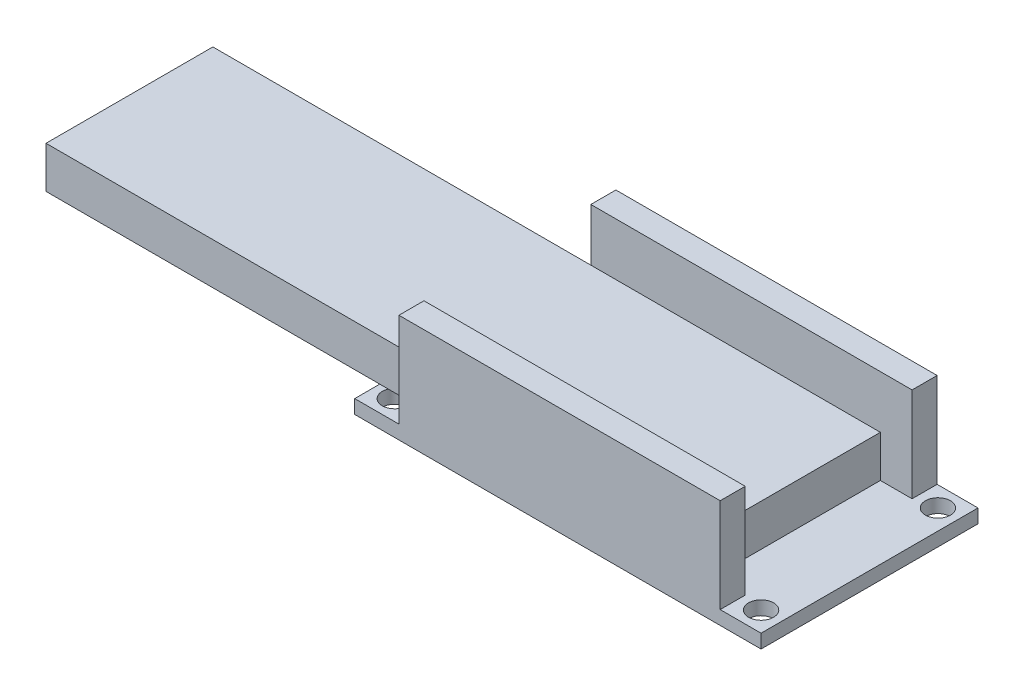
ISO-10303-21;
HEADER;
FILE_DESCRIPTION(('STEP AP214'),'2;1');
FILE_NAME('part.step','',(''),(''),'','','');
FILE_SCHEMA(('AUTOMOTIVE_DESIGN { 1 0 10303 214 1 1 1 1 }'));
ENDSEC;
DATA;
#1=APPLICATION_CONTEXT('core data for automotive mechanical design processes');
#2=APPLICATION_PROTOCOL_DEFINITION('international standard','automotive_design',2000,#1);
#3=PRODUCT_CONTEXT('',#1,'mechanical');
#4=PRODUCT('Part','Part','',(#3));
#5=PRODUCT_RELATED_PRODUCT_CATEGORY('part','',(#4));
#6=PRODUCT_DEFINITION_FORMATION('','',#4);
#7=PRODUCT_DEFINITION_CONTEXT('part definition',#1,'design');
#8=PRODUCT_DEFINITION('design','',#6,#7);
#9=PRODUCT_DEFINITION_SHAPE('','',#8);
#10=(LENGTH_UNIT() NAMED_UNIT(*) SI_UNIT(.MILLI.,.METRE.));
#11=(NAMED_UNIT(*) PLANE_ANGLE_UNIT() SI_UNIT($,.RADIAN.));
#12=(NAMED_UNIT(*) SI_UNIT($,.STERADIAN.) SOLID_ANGLE_UNIT());
#13=UNCERTAINTY_MEASURE_WITH_UNIT(LENGTH_MEASURE(1.E-05),#10,'distance_accuracy_value','');
#14=(GEOMETRIC_REPRESENTATION_CONTEXT(3) GLOBAL_UNCERTAINTY_ASSIGNED_CONTEXT((#13)) GLOBAL_UNIT_ASSIGNED_CONTEXT((#10,
#11,#12)) REPRESENTATION_CONTEXT('',''));
#15=CARTESIAN_POINT('',(0.,0.,0.));
#16=DIRECTION('',(0.,0.,1.));
#17=DIRECTION('',(1.,0.,0.));
#18=AXIS2_PLACEMENT_3D('',#15,#16,#17);
#19=CARTESIAN_POINT('',(0.,1.65,0.));
#20=DIRECTION('',(0.,1.,0.));
#21=DIRECTION('',(0.,0.,1.));
#22=AXIS2_PLACEMENT_3D('',#19,#20,#21);
#23=PLANE('',#22);
#24=CARTESIAN_POINT('',(21.95,1.65,10.6));
#25=DIRECTION('',(0.,1.,0.));
#26=DIRECTION('',(0.,0.,1.));
#27=AXIS2_PLACEMENT_3D('',#24,#25,#26);
#28=CIRCLE('',#27,1.5);
#29=CARTESIAN_POINT('',(21.95,1.65,12.1));
#30=VERTEX_POINT('',#29);
#31=EDGE_CURVE('E296',#30,#30,#28,.T.);
#32=ORIENTED_EDGE('',*,*,#31,.F.);
#33=EDGE_LOOP('',(#32));
#34=FACE_BOUND('',#33,.T.);
#35=CARTESIAN_POINT('',(21.95,1.65,-10.6));
#36=DIRECTION('',(0.,1.,0.));
#37=DIRECTION('',(0.,0.,-1.));
#38=AXIS2_PLACEMENT_3D('',#35,#36,#37);
#39=CIRCLE('',#38,1.5);
#40=CARTESIAN_POINT('',(21.95,1.65,-12.1));
#41=VERTEX_POINT('',#40);
#42=EDGE_CURVE('E290',#41,#41,#39,.T.);
#43=ORIENTED_EDGE('',*,*,#42,.F.);
#44=EDGE_LOOP('',(#43));
#45=FACE_BOUND('',#44,.T.);
#46=DIRECTION('',(1.,0.,0.));
#47=VECTOR('',#46,1.);
#48=CARTESIAN_POINT('',(-19.05,1.65,-10.));
#49=LINE('',#48,#47);
#50=CARTESIAN_POINT('',(15.65,1.65,-10.));
#51=VERTEX_POINT('',#50);
#52=CARTESIAN_POINT('',(19.45,1.65,-10.));
#53=VERTEX_POINT('',#52);
#54=EDGE_CURVE('E275',#51,#53,#49,.T.);
#55=ORIENTED_EDGE('',*,*,#54,.F.);
#56=DIRECTION('',(0.,0.,-1.));
#57=VECTOR('',#56,1.);
#58=CARTESIAN_POINT('',(15.65,1.65,-10.));
#59=LINE('',#58,#57);
#60=CARTESIAN_POINT('',(15.65,1.65,10.));
#61=VERTEX_POINT('',#60);
#62=EDGE_CURVE('E193',#61,#51,#59,.T.);
#63=ORIENTED_EDGE('',*,*,#62,.F.);
#64=DIRECTION('',(-1.,0.,0.));
#65=VECTOR('',#64,1.);
#66=CARTESIAN_POINT('',(-19.05,1.65,10.));
#67=LINE('',#66,#65);
#68=CARTESIAN_POINT('',(19.45,1.65,10.));
#69=VERTEX_POINT('',#68);
#70=EDGE_CURVE('E51',#69,#61,#67,.T.);
#71=ORIENTED_EDGE('',*,*,#70,.F.);
#72=DIRECTION('',(0.,0.,-1.));
#73=VECTOR('',#72,1.);
#74=CARTESIAN_POINT('',(19.45,1.65,13.));
#75=LINE('',#74,#73);
#76=CARTESIAN_POINT('',(19.45,1.65,13.));
#77=VERTEX_POINT('',#76);
#78=EDGE_CURVE('E252',#77,#69,#75,.T.);
#79=ORIENTED_EDGE('',*,*,#78,.F.);
#80=DIRECTION('',(1.,0.,0.));
#81=VECTOR('',#80,1.);
#82=CARTESIAN_POINT('',(-24.35,1.65,13.));
#83=LINE('',#82,#81);
#84=CARTESIAN_POINT('',(24.35,1.65,13.));
#85=VERTEX_POINT('',#84);
#86=EDGE_CURVE('E325',#77,#85,#83,.T.);
#87=ORIENTED_EDGE('',*,*,#86,.T.);
#88=DIRECTION('',(0.,0.,-1.));
#89=VECTOR('',#88,1.);
#90=CARTESIAN_POINT('',(24.35,1.65,-13.));
#91=LINE('',#90,#89);
#92=CARTESIAN_POINT('',(24.35,1.65,-13.));
#93=VERTEX_POINT('',#92);
#94=EDGE_CURVE('E314',#85,#93,#91,.T.);
#95=ORIENTED_EDGE('',*,*,#94,.T.);
#96=DIRECTION('',(-1.,0.,0.));
#97=VECTOR('',#96,1.);
#98=CARTESIAN_POINT('',(-24.35,1.65,-13.));
#99=LINE('',#98,#97);
#100=CARTESIAN_POINT('',(19.45,1.65,-13.));
#101=VERTEX_POINT('',#100);
#102=EDGE_CURVE('E319',#93,#101,#99,.T.);
#103=ORIENTED_EDGE('',*,*,#102,.T.);
#104=DIRECTION('',(0.,0.,-1.));
#105=VECTOR('',#104,1.);
#106=CARTESIAN_POINT('',(19.45,1.65,-13.));
#107=LINE('',#106,#105);
#108=EDGE_CURVE('E266',#53,#101,#107,.T.);
#109=ORIENTED_EDGE('',*,*,#108,.F.);
#110=EDGE_LOOP('',(#55,#63,#71,#79,#87,#95,#103,#109));
#111=FACE_BOUND('',#110,.T.);
#112=ADVANCED_FACE('F36',(#34,#45,#111),#23,.T.);
#113=DIRECTION('',(0.,0.,1.));
#114=VECTOR('',#113,1.);
#115=CARTESIAN_POINT('',(-24.35,1.65,-13.));
#116=LINE('',#115,#114);
#117=CARTESIAN_POINT('',(-24.35,1.65,-13.));
#118=VERTEX_POINT('',#117);
#119=CARTESIAN_POINT('',(-24.35,1.65,-10.));
#120=VERTEX_POINT('',#119);
#121=EDGE_CURVE('E322',#118,#120,#116,.T.);
#122=ORIENTED_EDGE('',*,*,#121,.T.);
#123=DIRECTION('',(-1.,0.,0.));
#124=VECTOR('',#123,1.);
#125=CARTESIAN_POINT('',(-64.35,1.65,-10.));
#126=LINE('',#125,#124);
#127=CARTESIAN_POINT('',(-23.3247727084868,1.65,-10.));
#128=VERTEX_POINT('',#127);
#129=EDGE_CURVE('E213',#128,#120,#126,.T.);
#130=ORIENTED_EDGE('',*,*,#129,.F.);
#131=CARTESIAN_POINT('',(-21.95,1.65,-10.6));
#132=DIRECTION('',(0.,1.,0.));
#133=DIRECTION('',(0.,0.,1.));
#134=AXIS2_PLACEMENT_3D('',#131,#132,#133);
#135=CIRCLE('',#134,1.5);
#136=CARTESIAN_POINT('',(-20.5752272915132,1.65,-10.));
#137=VERTEX_POINT('',#136);
#138=EDGE_CURVE('E308',#137,#128,#135,.T.);
#139=ORIENTED_EDGE('',*,*,#138,.F.);
#140=CARTESIAN_POINT('',(-19.05,1.65,-10.));
#141=VERTEX_POINT('',#140);
#142=EDGE_CURVE('E214',#141,#137,#126,.T.);
#143=ORIENTED_EDGE('',*,*,#142,.F.);
#144=DIRECTION('',(0.,0.,1.));
#145=VECTOR('',#144,1.);
#146=CARTESIAN_POINT('',(-19.05,1.65,-13.));
#147=LINE('',#146,#145);
#148=CARTESIAN_POINT('',(-19.05,1.65,-13.));
#149=VERTEX_POINT('',#148);
#150=EDGE_CURVE('E254',#149,#141,#147,.T.);
#151=ORIENTED_EDGE('',*,*,#150,.F.);
#152=EDGE_CURVE('E317',#149,#118,#99,.T.);
#153=ORIENTED_EDGE('',*,*,#152,.T.);
#154=EDGE_LOOP('',(#122,#130,#139,#143,#151,#153));
#155=FACE_BOUND('',#154,.T.);
#156=ADVANCED_FACE('F387',(#155),#23,.T.);
#157=DIRECTION('',(0.,0.,1.));
#158=VECTOR('',#157,1.);
#159=CARTESIAN_POINT('',(-19.05,1.65,13.));
#160=LINE('',#159,#158);
#161=CARTESIAN_POINT('',(-19.05,1.65,10.));
#162=VERTEX_POINT('',#161);
#163=CARTESIAN_POINT('',(-19.05,1.65,13.));
#164=VERTEX_POINT('',#163);
#165=EDGE_CURVE('E247',#162,#164,#160,.T.);
#166=ORIENTED_EDGE('',*,*,#165,.F.);
#167=DIRECTION('',(1.,0.,0.));
#168=VECTOR('',#167,1.);
#169=CARTESIAN_POINT('',(-64.35,1.65,10.));
#170=LINE('',#169,#168);
#171=CARTESIAN_POINT('',(-20.5752272915132,1.65,10.));
#172=VERTEX_POINT('',#171);
#173=EDGE_CURVE('E59',#172,#162,#170,.T.);
#174=ORIENTED_EDGE('',*,*,#173,.F.);
#175=CARTESIAN_POINT('',(-21.95,1.65,10.6));
#176=DIRECTION('',(0.,1.,0.));
#177=DIRECTION('',(0.,0.,-1.));
#178=AXIS2_PLACEMENT_3D('',#175,#176,#177);
#179=CIRCLE('',#178,1.5);
#180=CARTESIAN_POINT('',(-23.3247727084868,1.65,10.));
#181=VERTEX_POINT('',#180);
#182=EDGE_CURVE('E302',#181,#172,#179,.T.);
#183=ORIENTED_EDGE('',*,*,#182,.F.);
#184=CARTESIAN_POINT('',(-24.35,1.65,10.));
#185=VERTEX_POINT('',#184);
#186=EDGE_CURVE('E219',#185,#181,#170,.T.);
#187=ORIENTED_EDGE('',*,*,#186,.F.);
#188=CARTESIAN_POINT('',(-24.35,1.65,13.));
#189=VERTEX_POINT('',#188);
#190=EDGE_CURVE('E321',#185,#189,#116,.T.);
#191=ORIENTED_EDGE('',*,*,#190,.T.);
#192=EDGE_CURVE('E326',#189,#164,#83,.T.);
#193=ORIENTED_EDGE('',*,*,#192,.T.);
#194=EDGE_LOOP('',(#166,#174,#183,#187,#191,#193));
#195=FACE_BOUND('',#194,.T.);
#196=ADVANCED_FACE('F378',(#195),#23,.T.);
#197=CARTESIAN_POINT('',(-19.05,12.95,-10.));
#198=DIRECTION('',(0.,0.,-1.));
#199=DIRECTION('',(-1.,0.,0.));
#200=AXIS2_PLACEMENT_3D('',#197,#198,#199);
#201=PLANE('',#200);
#202=DIRECTION('',(0.,-1.,0.));
#203=VECTOR('',#202,1.);
#204=CARTESIAN_POINT('',(15.65,6.65,-10.));
#205=LINE('',#204,#203);
#206=CARTESIAN_POINT('',(15.65,6.65,-10.));
#207=VERTEX_POINT('',#206);
#208=EDGE_CURVE('E191',#207,#51,#205,.T.);
#209=ORIENTED_EDGE('',*,*,#208,.T.);
#210=ORIENTED_EDGE('',*,*,#54,.T.);
#211=DIRECTION('',(0.,-1.,0.));
#212=VECTOR('',#211,1.);
#213=CARTESIAN_POINT('',(19.45,12.95,-10.));
#214=LINE('',#213,#212);
#215=CARTESIAN_POINT('',(19.45,12.95,-10.));
#216=VERTEX_POINT('',#215);
#217=EDGE_CURVE('E284',#216,#53,#214,.T.);
#218=ORIENTED_EDGE('',*,*,#217,.F.);
#219=DIRECTION('',(1.,0.,0.));
#220=VECTOR('',#219,1.);
#221=CARTESIAN_POINT('',(-19.05,12.95,-10.));
#222=LINE('',#221,#220);
#223=CARTESIAN_POINT('',(-19.05,12.95,-10.));
#224=VERTEX_POINT('',#223);
#225=EDGE_CURVE('E265',#224,#216,#222,.T.);
#226=ORIENTED_EDGE('',*,*,#225,.F.);
#227=DIRECTION('',(0.,-1.,0.));
#228=VECTOR('',#227,1.);
#229=CARTESIAN_POINT('',(-19.05,12.95,-10.));
#230=LINE('',#229,#228);
#231=CARTESIAN_POINT('',(-19.05,6.65,-10.));
#232=VERTEX_POINT('',#231);
#233=EDGE_CURVE('E202',#224,#232,#230,.T.);
#234=ORIENTED_EDGE('',*,*,#233,.T.);
#235=DIRECTION('',(-1.,0.,0.));
#236=VECTOR('',#235,1.);
#237=CARTESIAN_POINT('',(-64.35,6.65,-10.));
#238=LINE('',#237,#236);
#239=EDGE_CURVE('E180',#207,#232,#238,.T.);
#240=ORIENTED_EDGE('',*,*,#239,.F.);
#241=EDGE_LOOP('',(#209,#210,#218,#226,#234,#240));
#242=FACE_BOUND('',#241,.T.);
#243=ADVANCED_FACE('F200',(#242),#201,.F.);
#244=CARTESIAN_POINT('',(-19.05,12.95,10.));
#245=DIRECTION('',(0.,0.,1.));
#246=DIRECTION('',(1.,0.,0.));
#247=AXIS2_PLACEMENT_3D('',#244,#245,#246);
#248=PLANE('',#247);
#249=DIRECTION('',(0.,-1.,0.));
#250=VECTOR('',#249,1.);
#251=CARTESIAN_POINT('',(15.65,6.65,10.));
#252=LINE('',#251,#250);
#253=CARTESIAN_POINT('',(15.65,6.65,10.));
#254=VERTEX_POINT('',#253);
#255=EDGE_CURVE('E209',#254,#61,#252,.T.);
#256=ORIENTED_EDGE('',*,*,#255,.F.);
#257=DIRECTION('',(1.,0.,0.));
#258=VECTOR('',#257,1.);
#259=CARTESIAN_POINT('',(-64.35,6.65,10.));
#260=LINE('',#259,#258);
#261=CARTESIAN_POINT('',(-19.05,6.65,10.));
#262=VERTEX_POINT('',#261);
#263=EDGE_CURVE('E184',#262,#254,#260,.T.);
#264=ORIENTED_EDGE('',*,*,#263,.F.);
#265=DIRECTION('',(0.,-1.,0.));
#266=VECTOR('',#265,1.);
#267=CARTESIAN_POINT('',(-19.05,12.95,10.));
#268=LINE('',#267,#266);
#269=CARTESIAN_POINT('',(-19.05,12.95,10.));
#270=VERTEX_POINT('',#269);
#271=EDGE_CURVE('E240',#270,#262,#268,.T.);
#272=ORIENTED_EDGE('',*,*,#271,.F.);
#273=DIRECTION('',(-1.,0.,0.));
#274=VECTOR('',#273,1.);
#275=CARTESIAN_POINT('',(-19.05,12.95,10.));
#276=LINE('',#275,#274);
#277=CARTESIAN_POINT('',(19.45,12.95,10.));
#278=VERTEX_POINT('',#277);
#279=EDGE_CURVE('E256',#278,#270,#276,.T.);
#280=ORIENTED_EDGE('',*,*,#279,.F.);
#281=DIRECTION('',(0.,-1.,0.));
#282=VECTOR('',#281,1.);
#283=CARTESIAN_POINT('',(19.45,12.95,10.));
#284=LINE('',#283,#282);
#285=EDGE_CURVE('E236',#278,#69,#284,.T.);
#286=ORIENTED_EDGE('',*,*,#285,.T.);
#287=ORIENTED_EDGE('',*,*,#70,.T.);
#288=EDGE_LOOP('',(#256,#264,#272,#280,#286,#287));
#289=FACE_BOUND('',#288,.T.);
#290=ADVANCED_FACE('F405',(#289),#248,.F.);
#291=CARTESIAN_POINT('',(0.,0.,0.));
#292=DIRECTION('',(0.,1.,0.));
#293=DIRECTION('',(0.,0.,1.));
#294=AXIS2_PLACEMENT_3D('',#291,#292,#293);
#295=PLANE('',#294);
#296=DIRECTION('',(0.,0.,-1.));
#297=VECTOR('',#296,1.);
#298=CARTESIAN_POINT('',(24.35,0.,-13.));
#299=LINE('',#298,#297);
#300=CARTESIAN_POINT('',(24.35,0.,13.));
#301=VERTEX_POINT('',#300);
#302=CARTESIAN_POINT('',(24.35,0.,-13.));
#303=VERTEX_POINT('',#302);
#304=EDGE_CURVE('E311',#301,#303,#299,.T.);
#305=ORIENTED_EDGE('',*,*,#304,.F.);
#306=DIRECTION('',(1.,0.,0.));
#307=VECTOR('',#306,1.);
#308=CARTESIAN_POINT('',(-24.35,0.,13.));
#309=LINE('',#308,#307);
#310=CARTESIAN_POINT('',(-24.35,0.,13.));
#311=VERTEX_POINT('',#310);
#312=EDGE_CURVE('E318',#311,#301,#309,.T.);
#313=ORIENTED_EDGE('',*,*,#312,.F.);
#314=DIRECTION('',(0.,0.,1.));
#315=VECTOR('',#314,1.);
#316=CARTESIAN_POINT('',(-24.35,0.,-13.));
#317=LINE('',#316,#315);
#318=CARTESIAN_POINT('',(-24.35,0.,-13.));
#319=VERTEX_POINT('',#318);
#320=EDGE_CURVE('E333',#319,#311,#317,.T.);
#321=ORIENTED_EDGE('',*,*,#320,.F.);
#322=DIRECTION('',(-1.,0.,0.));
#323=VECTOR('',#322,1.);
#324=CARTESIAN_POINT('',(-24.35,0.,-13.));
#325=LINE('',#324,#323);
#326=EDGE_CURVE('E331',#303,#319,#325,.T.);
#327=ORIENTED_EDGE('',*,*,#326,.F.);
#328=EDGE_LOOP('',(#305,#313,#321,#327));
#329=FACE_BOUND('',#328,.T.);
#330=CARTESIAN_POINT('',(-21.95,0.,-10.6));
#331=DIRECTION('',(0.,1.,0.));
#332=DIRECTION('',(0.,0.,1.));
#333=AXIS2_PLACEMENT_3D('',#330,#331,#332);
#334=CIRCLE('',#333,1.5);
#335=CARTESIAN_POINT('',(-21.95,0.,-9.1));
#336=VERTEX_POINT('',#335);
#337=EDGE_CURVE('E305',#336,#336,#334,.T.);
#338=ORIENTED_EDGE('',*,*,#337,.T.);
#339=EDGE_LOOP('',(#338));
#340=FACE_BOUND('',#339,.T.);
#341=CARTESIAN_POINT('',(-21.95,0.,10.6));
#342=DIRECTION('',(0.,1.,0.));
#343=DIRECTION('',(0.,0.,-1.));
#344=AXIS2_PLACEMENT_3D('',#341,#342,#343);
#345=CIRCLE('',#344,1.5);
#346=CARTESIAN_POINT('',(-21.95,0.,9.09999999999999));
#347=VERTEX_POINT('',#346);
#348=EDGE_CURVE('E299',#347,#347,#345,.T.);
#349=ORIENTED_EDGE('',*,*,#348,.T.);
#350=EDGE_LOOP('',(#349));
#351=FACE_BOUND('',#350,.T.);
#352=CARTESIAN_POINT('',(21.95,0.,10.6));
#353=DIRECTION('',(0.,1.,0.));
#354=DIRECTION('',(0.,0.,1.));
#355=AXIS2_PLACEMENT_3D('',#352,#353,#354);
#356=CIRCLE('',#355,1.5);
#357=CARTESIAN_POINT('',(21.95,0.,12.1));
#358=VERTEX_POINT('',#357);
#359=EDGE_CURVE('E293',#358,#358,#356,.T.);
#360=ORIENTED_EDGE('',*,*,#359,.T.);
#361=EDGE_LOOP('',(#360));
#362=FACE_BOUND('',#361,.T.);
#363=CARTESIAN_POINT('',(21.95,0.,-10.6));
#364=DIRECTION('',(0.,1.,0.));
#365=DIRECTION('',(0.,0.,-1.));
#366=AXIS2_PLACEMENT_3D('',#363,#364,#365);
#367=CIRCLE('',#366,1.5);
#368=CARTESIAN_POINT('',(21.95,0.,-12.1));
#369=VERTEX_POINT('',#368);
#370=EDGE_CURVE('E289',#369,#369,#367,.T.);
#371=ORIENTED_EDGE('',*,*,#370,.T.);
#372=EDGE_LOOP('',(#371));
#373=FACE_BOUND('',#372,.T.);
#374=ADVANCED_FACE('F353',(#329,#340,#351,#362,#373),#295,.F.);
#375=CARTESIAN_POINT('',(24.35,1.65,-13.));
#376=DIRECTION('',(-1.,0.,0.));
#377=DIRECTION('',(0.,0.,1.));
#378=AXIS2_PLACEMENT_3D('',#375,#376,#377);
#379=PLANE('',#378);
#380=ORIENTED_EDGE('',*,*,#304,.T.);
#381=DIRECTION('',(0.,-1.,0.));
#382=VECTOR('',#381,1.);
#383=CARTESIAN_POINT('',(24.35,1.65,-13.));
#384=LINE('',#383,#382);
#385=EDGE_CURVE('E11',#93,#303,#384,.T.);
#386=ORIENTED_EDGE('',*,*,#385,.F.);
#387=ORIENTED_EDGE('',*,*,#94,.F.);
#388=DIRECTION('',(0.,-1.,0.));
#389=VECTOR('',#388,1.);
#390=CARTESIAN_POINT('',(24.35,1.65,13.));
#391=LINE('',#390,#389);
#392=EDGE_CURVE('E328',#85,#301,#391,.T.);
#393=ORIENTED_EDGE('',*,*,#392,.T.);
#394=EDGE_LOOP('',(#380,#386,#387,#393));
#395=FACE_BOUND('',#394,.T.);
#396=ADVANCED_FACE('F38',(#395),#379,.F.);
#397=CARTESIAN_POINT('',(-24.35,1.65,-13.));
#398=DIRECTION('',(0.,0.,1.));
#399=DIRECTION('',(1.,0.,0.));
#400=AXIS2_PLACEMENT_3D('',#397,#398,#399);
#401=PLANE('',#400);
#402=ORIENTED_EDGE('',*,*,#326,.T.);
#403=DIRECTION('',(0.,-1.,0.));
#404=VECTOR('',#403,1.);
#405=CARTESIAN_POINT('',(-24.35,1.65,-13.));
#406=LINE('',#405,#404);
#407=EDGE_CURVE('E44',#118,#319,#406,.T.);
#408=ORIENTED_EDGE('',*,*,#407,.F.);
#409=ORIENTED_EDGE('',*,*,#152,.F.);
#410=DIRECTION('',(0.,-1.,0.));
#411=VECTOR('',#410,1.);
#412=CARTESIAN_POINT('',(-19.05,12.95,-13.));
#413=LINE('',#412,#411);
#414=CARTESIAN_POINT('',(-19.05,12.95,-13.));
#415=VERTEX_POINT('',#414);
#416=EDGE_CURVE('E272',#415,#149,#413,.T.);
#417=ORIENTED_EDGE('',*,*,#416,.F.);
#418=DIRECTION('',(-1.,0.,0.));
#419=VECTOR('',#418,1.);
#420=CARTESIAN_POINT('',(-19.05,12.95,-13.));
#421=LINE('',#420,#419);
#422=CARTESIAN_POINT('',(19.45,12.95,-13.));
#423=VERTEX_POINT('',#422);
#424=EDGE_CURVE('E270',#423,#415,#421,.T.);
#425=ORIENTED_EDGE('',*,*,#424,.F.);
#426=DIRECTION('',(0.,-1.,0.));
#427=VECTOR('',#426,1.);
#428=CARTESIAN_POINT('',(19.45,12.95,-13.));
#429=LINE('',#428,#427);
#430=EDGE_CURVE('E281',#423,#101,#429,.T.);
#431=ORIENTED_EDGE('',*,*,#430,.T.);
#432=ORIENTED_EDGE('',*,*,#102,.F.);
#433=ORIENTED_EDGE('',*,*,#385,.T.);
#434=EDGE_LOOP('',(#402,#408,#409,#417,#425,#431,#432,#433));
#435=FACE_BOUND('',#434,.T.);
#436=ADVANCED_FACE('F392',(#435),#401,.F.);
#437=CARTESIAN_POINT('',(-24.35,1.65,-13.));
#438=DIRECTION('',(1.,0.,0.));
#439=DIRECTION('',(0.,0.,-1.));
#440=AXIS2_PLACEMENT_3D('',#437,#438,#439);
#441=PLANE('',#440);
#442=ORIENTED_EDGE('',*,*,#320,.T.);
#443=DIRECTION('',(0.,-1.,0.));
#444=VECTOR('',#443,1.);
#445=CARTESIAN_POINT('',(-24.35,1.65,13.));
#446=LINE('',#445,#444);
#447=EDGE_CURVE('E338',#189,#311,#446,.T.);
#448=ORIENTED_EDGE('',*,*,#447,.F.);
#449=ORIENTED_EDGE('',*,*,#190,.F.);
#450=DIRECTION('',(0.,0.,1.));
#451=VECTOR('',#450,1.);
#452=CARTESIAN_POINT('',(-24.35,1.65,-13.));
#453=LINE('',#452,#451);
#454=EDGE_CURVE('E231',#120,#185,#453,.T.);
#455=ORIENTED_EDGE('',*,*,#454,.F.);
#456=ORIENTED_EDGE('',*,*,#121,.F.);
#457=ORIENTED_EDGE('',*,*,#407,.T.);
#458=EDGE_LOOP('',(#442,#448,#449,#455,#456,#457));
#459=FACE_BOUND('',#458,.T.);
#460=ADVANCED_FACE('F345',(#459),#441,.F.);
#461=CARTESIAN_POINT('',(-24.35,1.65,13.));
#462=DIRECTION('',(0.,0.,-1.));
#463=DIRECTION('',(-1.,0.,0.));
#464=AXIS2_PLACEMENT_3D('',#461,#462,#463);
#465=PLANE('',#464);
#466=ORIENTED_EDGE('',*,*,#312,.T.);
#467=ORIENTED_EDGE('',*,*,#392,.F.);
#468=ORIENTED_EDGE('',*,*,#86,.F.);
#469=DIRECTION('',(0.,-1.,0.));
#470=VECTOR('',#469,1.);
#471=CARTESIAN_POINT('',(19.45,12.95,13.));
#472=LINE('',#471,#470);
#473=CARTESIAN_POINT('',(19.45,12.95,13.));
#474=VERTEX_POINT('',#473);
#475=EDGE_CURVE('E233',#474,#77,#472,.T.);
#476=ORIENTED_EDGE('',*,*,#475,.F.);
#477=DIRECTION('',(1.,0.,0.));
#478=VECTOR('',#477,1.);
#479=CARTESIAN_POINT('',(-19.05,12.95,13.));
#480=LINE('',#479,#478);
#481=CARTESIAN_POINT('',(-19.05,12.95,13.));
#482=VERTEX_POINT('',#481);
#483=EDGE_CURVE('E250',#482,#474,#480,.T.);
#484=ORIENTED_EDGE('',*,*,#483,.F.);
#485=DIRECTION('',(0.,-1.,0.));
#486=VECTOR('',#485,1.);
#487=CARTESIAN_POINT('',(-19.05,12.95,13.));
#488=LINE('',#487,#486);
#489=EDGE_CURVE('E243',#482,#164,#488,.T.);
#490=ORIENTED_EDGE('',*,*,#489,.T.);
#491=ORIENTED_EDGE('',*,*,#192,.F.);
#492=ORIENTED_EDGE('',*,*,#447,.T.);
#493=EDGE_LOOP('',(#466,#467,#468,#476,#484,#490,#491,#492));
#494=FACE_BOUND('',#493,.T.);
#495=ADVANCED_FACE('F357',(#494),#465,.F.);
#496=CARTESIAN_POINT('',(-21.95,1.65,-10.6));
#497=DIRECTION('',(0.,-1.,0.));
#498=DIRECTION('',(0.,0.,-1.));
#499=AXIS2_PLACEMENT_3D('',#496,#497,#498);
#500=CYLINDRICAL_SURFACE('',#499,1.5);
#501=ORIENTED_EDGE('',*,*,#138,.T.);
#502=CARTESIAN_POINT('',(-21.95,1.65,-10.6));
#503=DIRECTION('',(0.,1.,0.));
#504=DIRECTION('',(0.,0.,1.));
#505=AXIS2_PLACEMENT_3D('',#502,#503,#504);
#506=CIRCLE('',#505,1.5);
#507=EDGE_CURVE('E228',#128,#137,#506,.T.);
#508=ORIENTED_EDGE('',*,*,#507,.T.);
#509=EDGE_LOOP('',(#501,#508));
#510=FACE_BOUND('',#509,.T.);
#511=ORIENTED_EDGE('',*,*,#337,.F.);
#512=EDGE_LOOP('',(#511));
#513=FACE_BOUND('',#512,.T.);
#514=ADVANCED_FACE('F421',(#510,#513),#500,.F.);
#515=CARTESIAN_POINT('',(-21.95,1.65,10.6));
#516=DIRECTION('',(0.,-1.,0.));
#517=DIRECTION('',(0.,0.,-1.));
#518=AXIS2_PLACEMENT_3D('',#515,#516,#517);
#519=CYLINDRICAL_SURFACE('',#518,1.5);
#520=ORIENTED_EDGE('',*,*,#182,.T.);
#521=CARTESIAN_POINT('',(-21.95,1.65,10.6));
#522=DIRECTION('',(0.,1.,0.));
#523=DIRECTION('',(0.,0.,1.));
#524=AXIS2_PLACEMENT_3D('',#521,#522,#523);
#525=CIRCLE('',#524,1.5);
#526=EDGE_CURVE('E196',#172,#181,#525,.T.);
#527=ORIENTED_EDGE('',*,*,#526,.T.);
#528=EDGE_LOOP('',(#520,#527));
#529=FACE_BOUND('',#528,.T.);
#530=ORIENTED_EDGE('',*,*,#348,.F.);
#531=EDGE_LOOP('',(#530));
#532=FACE_BOUND('',#531,.T.);
#533=ADVANCED_FACE('F467',(#529,#532),#519,.F.);
#534=CARTESIAN_POINT('',(21.95,1.65,10.6));
#535=DIRECTION('',(0.,-1.,0.));
#536=DIRECTION('',(0.,0.,-1.));
#537=AXIS2_PLACEMENT_3D('',#534,#535,#536);
#538=CYLINDRICAL_SURFACE('',#537,1.5);
#539=ORIENTED_EDGE('',*,*,#31,.T.);
#540=EDGE_LOOP('',(#539));
#541=FACE_BOUND('',#540,.T.);
#542=ORIENTED_EDGE('',*,*,#359,.F.);
#543=EDGE_LOOP('',(#542));
#544=FACE_BOUND('',#543,.T.);
#545=ADVANCED_FACE('F463',(#541,#544),#538,.F.);
#546=CARTESIAN_POINT('',(21.95,1.65,-10.6));
#547=DIRECTION('',(0.,-1.,0.));
#548=DIRECTION('',(0.,0.,-1.));
#549=AXIS2_PLACEMENT_3D('',#546,#547,#548);
#550=CYLINDRICAL_SURFACE('',#549,1.5);
#551=ORIENTED_EDGE('',*,*,#42,.T.);
#552=EDGE_LOOP('',(#551));
#553=FACE_BOUND('',#552,.T.);
#554=ORIENTED_EDGE('',*,*,#370,.F.);
#555=EDGE_LOOP('',(#554));
#556=FACE_BOUND('',#555,.T.);
#557=ADVANCED_FACE('F460',(#553,#556),#550,.F.);
#558=CARTESIAN_POINT('',(-19.05,12.95,-13.));
#559=DIRECTION('',(1.,0.,0.));
#560=DIRECTION('',(0.,0.,-1.));
#561=AXIS2_PLACEMENT_3D('',#558,#559,#560);
#562=PLANE('',#561);
#563=ORIENTED_EDGE('',*,*,#150,.T.);
#564=EDGE_CURVE('E287',#232,#141,#230,.T.);
#565=ORIENTED_EDGE('',*,*,#564,.F.);
#566=ORIENTED_EDGE('',*,*,#233,.F.);
#567=DIRECTION('',(0.,0.,1.));
#568=VECTOR('',#567,1.);
#569=CARTESIAN_POINT('',(-19.05,12.95,-13.));
#570=LINE('',#569,#568);
#571=EDGE_CURVE('E262',#415,#224,#570,.T.);
#572=ORIENTED_EDGE('',*,*,#571,.F.);
#573=ORIENTED_EDGE('',*,*,#416,.T.);
#574=EDGE_LOOP('',(#563,#565,#566,#572,#573));
#575=FACE_BOUND('',#574,.T.);
#576=ADVANCED_FACE('F396',(#575),#562,.F.);
#577=CARTESIAN_POINT('',(19.45,12.95,-13.));
#578=DIRECTION('',(-1.,0.,0.));
#579=DIRECTION('',(0.,0.,1.));
#580=AXIS2_PLACEMENT_3D('',#577,#578,#579);
#581=PLANE('',#580);
#582=ORIENTED_EDGE('',*,*,#108,.T.);
#583=ORIENTED_EDGE('',*,*,#430,.F.);
#584=DIRECTION('',(0.,0.,-1.));
#585=VECTOR('',#584,1.);
#586=CARTESIAN_POINT('',(19.45,12.95,-13.));
#587=LINE('',#586,#585);
#588=EDGE_CURVE('E268',#216,#423,#587,.T.);
#589=ORIENTED_EDGE('',*,*,#588,.F.);
#590=ORIENTED_EDGE('',*,*,#217,.T.);
#591=EDGE_LOOP('',(#582,#583,#589,#590));
#592=FACE_BOUND('',#591,.T.);
#593=ADVANCED_FACE('F403',(#592),#581,.F.);
#594=CARTESIAN_POINT('',(0.,12.95,0.));
#595=DIRECTION('',(0.,1.,0.));
#596=DIRECTION('',(0.,0.,1.));
#597=AXIS2_PLACEMENT_3D('',#594,#595,#596);
#598=PLANE('',#597);
#599=ORIENTED_EDGE('',*,*,#571,.T.);
#600=ORIENTED_EDGE('',*,*,#225,.T.);
#601=ORIENTED_EDGE('',*,*,#588,.T.);
#602=ORIENTED_EDGE('',*,*,#424,.T.);
#603=EDGE_LOOP('',(#599,#600,#601,#602));
#604=FACE_BOUND('',#603,.T.);
#605=ADVANCED_FACE('F398',(#604),#598,.T.);
#606=CARTESIAN_POINT('',(19.45,12.95,13.));
#607=DIRECTION('',(-1.,0.,0.));
#608=DIRECTION('',(0.,0.,1.));
#609=AXIS2_PLACEMENT_3D('',#606,#607,#608);
#610=PLANE('',#609);
#611=ORIENTED_EDGE('',*,*,#78,.T.);
#612=ORIENTED_EDGE('',*,*,#285,.F.);
#613=DIRECTION('',(0.,0.,-1.));
#614=VECTOR('',#613,1.);
#615=CARTESIAN_POINT('',(19.45,12.95,13.));
#616=LINE('',#615,#614);
#617=EDGE_CURVE('E258',#474,#278,#616,.T.);
#618=ORIENTED_EDGE('',*,*,#617,.F.);
#619=ORIENTED_EDGE('',*,*,#475,.T.);
#620=EDGE_LOOP('',(#611,#612,#618,#619));
#621=FACE_BOUND('',#620,.T.);
#622=ADVANCED_FACE('F366',(#621),#610,.F.);
#623=CARTESIAN_POINT('',(-19.05,12.95,13.));
#624=DIRECTION('',(1.,0.,0.));
#625=DIRECTION('',(0.,0.,-1.));
#626=AXIS2_PLACEMENT_3D('',#623,#624,#625);
#627=PLANE('',#626);
#628=ORIENTED_EDGE('',*,*,#165,.T.);
#629=ORIENTED_EDGE('',*,*,#489,.F.);
#630=DIRECTION('',(0.,0.,1.));
#631=VECTOR('',#630,1.);
#632=CARTESIAN_POINT('',(-19.05,12.95,13.));
#633=LINE('',#632,#631);
#634=EDGE_CURVE('E246',#270,#482,#633,.T.);
#635=ORIENTED_EDGE('',*,*,#634,.F.);
#636=ORIENTED_EDGE('',*,*,#271,.T.);
#637=EDGE_CURVE('E239',#262,#162,#268,.T.);
#638=ORIENTED_EDGE('',*,*,#637,.T.);
#639=EDGE_LOOP('',(#628,#629,#635,#636,#638));
#640=FACE_BOUND('',#639,.T.);
#641=ADVANCED_FACE('F375',(#640),#627,.F.);
#642=CARTESIAN_POINT('',(0.,12.95,0.));
#643=DIRECTION('',(0.,1.,0.));
#644=DIRECTION('',(0.,0.,1.));
#645=AXIS2_PLACEMENT_3D('',#642,#643,#644);
#646=PLANE('',#645);
#647=ORIENTED_EDGE('',*,*,#483,.T.);
#648=ORIENTED_EDGE('',*,*,#617,.T.);
#649=ORIENTED_EDGE('',*,*,#279,.T.);
#650=ORIENTED_EDGE('',*,*,#634,.T.);
#651=EDGE_LOOP('',(#647,#648,#649,#650));
#652=FACE_BOUND('',#651,.T.);
#653=ADVANCED_FACE('F370',(#652),#646,.T.);
#654=CARTESIAN_POINT('',(-64.35,6.65,-10.));
#655=DIRECTION('',(0.,0.,1.));
#656=DIRECTION('',(1.,0.,0.));
#657=AXIS2_PLACEMENT_3D('',#654,#655,#656);
#658=PLANE('',#657);
#659=CARTESIAN_POINT('',(-64.35,6.65,-10.));
#660=VERTEX_POINT('',#659);
#661=EDGE_CURVE('E187',#232,#660,#238,.T.);
#662=ORIENTED_EDGE('',*,*,#661,.F.);
#663=ORIENTED_EDGE('',*,*,#564,.T.);
#664=ORIENTED_EDGE('',*,*,#142,.T.);
#665=EDGE_CURVE('E419',#137,#128,#126,.T.);
#666=ORIENTED_EDGE('',*,*,#665,.T.);
#667=ORIENTED_EDGE('',*,*,#129,.T.);
#668=CARTESIAN_POINT('',(-64.35,1.65,-10.));
#669=VERTEX_POINT('',#668);
#670=EDGE_CURVE('E211',#120,#669,#126,.T.);
#671=ORIENTED_EDGE('',*,*,#670,.T.);
#672=DIRECTION('',(0.,-1.,0.));
#673=VECTOR('',#672,1.);
#674=CARTESIAN_POINT('',(-64.35,6.65,-10.));
#675=LINE('',#674,#673);
#676=EDGE_CURVE('E197',#660,#669,#675,.T.);
#677=ORIENTED_EDGE('',*,*,#676,.F.);
#678=EDGE_LOOP('',(#662,#663,#664,#666,#667,#671,#677));
#679=FACE_BOUND('',#678,.T.);
#680=ADVANCED_FACE('F417',(#679),#658,.F.);
#681=CARTESIAN_POINT('',(0.,1.65,0.));
#682=DIRECTION('',(0.,1.,0.));
#683=DIRECTION('',(0.,0.,1.));
#684=AXIS2_PLACEMENT_3D('',#681,#682,#683);
#685=PLANE('',#684);
#686=ORIENTED_EDGE('',*,*,#670,.F.);
#687=ORIENTED_EDGE('',*,*,#454,.T.);
#688=CARTESIAN_POINT('',(-64.35,1.65,10.));
#689=VERTEX_POINT('',#688);
#690=EDGE_CURVE('E188',#689,#185,#170,.T.);
#691=ORIENTED_EDGE('',*,*,#690,.F.);
#692=DIRECTION('',(0.,0.,1.));
#693=VECTOR('',#692,1.);
#694=CARTESIAN_POINT('',(-64.35,1.65,-10.));
#695=LINE('',#694,#693);
#696=EDGE_CURVE('E215',#669,#689,#695,.T.);
#697=ORIENTED_EDGE('',*,*,#696,.F.);
#698=EDGE_LOOP('',(#686,#687,#691,#697));
#699=FACE_BOUND('',#698,.T.);
#700=ADVANCED_FACE('F414',(#699),#685,.F.);
#701=ORIENTED_EDGE('',*,*,#507,.F.);
#702=ORIENTED_EDGE('',*,*,#665,.F.);
#703=EDGE_LOOP('',(#701,#702));
#704=FACE_BOUND('',#703,.T.);
#705=ADVANCED_FACE('F424',(#704),#685,.F.);
#706=CARTESIAN_POINT('',(-64.35,6.65,10.));
#707=DIRECTION('',(0.,0.,-1.));
#708=DIRECTION('',(-1.,0.,0.));
#709=AXIS2_PLACEMENT_3D('',#706,#707,#708);
#710=PLANE('',#709);
#711=ORIENTED_EDGE('',*,*,#173,.T.);
#712=ORIENTED_EDGE('',*,*,#637,.F.);
#713=CARTESIAN_POINT('',(-64.35,6.65,10.));
#714=VERTEX_POINT('',#713);
#715=EDGE_CURVE('E207',#714,#262,#260,.T.);
#716=ORIENTED_EDGE('',*,*,#715,.F.);
#717=DIRECTION('',(0.,-1.,0.));
#718=VECTOR('',#717,1.);
#719=CARTESIAN_POINT('',(-64.35,6.65,10.));
#720=LINE('',#719,#718);
#721=EDGE_CURVE('E221',#714,#689,#720,.T.);
#722=ORIENTED_EDGE('',*,*,#721,.T.);
#723=ORIENTED_EDGE('',*,*,#690,.T.);
#724=ORIENTED_EDGE('',*,*,#186,.T.);
#725=EDGE_CURVE('E725',#181,#172,#170,.T.);
#726=ORIENTED_EDGE('',*,*,#725,.T.);
#727=EDGE_LOOP('',(#711,#712,#716,#722,#723,#724,#726));
#728=FACE_BOUND('',#727,.T.);
#729=ADVANCED_FACE('F407',(#728),#710,.F.);
#730=CARTESIAN_POINT('',(15.65,6.65,-10.));
#731=DIRECTION('',(-1.,0.,0.));
#732=DIRECTION('',(0.,0.,1.));
#733=AXIS2_PLACEMENT_3D('',#730,#731,#732);
#734=PLANE('',#733);
#735=ORIENTED_EDGE('',*,*,#62,.T.);
#736=ORIENTED_EDGE('',*,*,#208,.F.);
#737=DIRECTION('',(0.,0.,-1.));
#738=VECTOR('',#737,1.);
#739=CARTESIAN_POINT('',(15.65,6.65,-10.));
#740=LINE('',#739,#738);
#741=EDGE_CURVE('E176',#254,#207,#740,.T.);
#742=ORIENTED_EDGE('',*,*,#741,.F.);
#743=ORIENTED_EDGE('',*,*,#255,.T.);
#744=EDGE_LOOP('',(#735,#736,#742,#743));
#745=FACE_BOUND('',#744,.T.);
#746=ADVANCED_FACE('F192',(#745),#734,.F.);
#747=CARTESIAN_POINT('',(-64.35,6.65,-10.));
#748=DIRECTION('',(1.,0.,0.));
#749=DIRECTION('',(0.,0.,-1.));
#750=AXIS2_PLACEMENT_3D('',#747,#748,#749);
#751=PLANE('',#750);
#752=ORIENTED_EDGE('',*,*,#696,.T.);
#753=ORIENTED_EDGE('',*,*,#721,.F.);
#754=DIRECTION('',(0.,0.,1.));
#755=VECTOR('',#754,1.);
#756=CARTESIAN_POINT('',(-64.35,6.65,-10.));
#757=LINE('',#756,#755);
#758=EDGE_CURVE('E203',#660,#714,#757,.T.);
#759=ORIENTED_EDGE('',*,*,#758,.F.);
#760=ORIENTED_EDGE('',*,*,#676,.T.);
#761=EDGE_LOOP('',(#752,#753,#759,#760));
#762=FACE_BOUND('',#761,.T.);
#763=ADVANCED_FACE('F412',(#762),#751,.F.);
#764=CARTESIAN_POINT('',(0.,6.65,0.));
#765=DIRECTION('',(0.,1.,0.));
#766=DIRECTION('',(0.,0.,1.));
#767=AXIS2_PLACEMENT_3D('',#764,#765,#766);
#768=PLANE('',#767);
#769=ORIENTED_EDGE('',*,*,#741,.T.);
#770=ORIENTED_EDGE('',*,*,#239,.T.);
#771=ORIENTED_EDGE('',*,*,#661,.T.);
#772=ORIENTED_EDGE('',*,*,#758,.T.);
#773=ORIENTED_EDGE('',*,*,#715,.T.);
#774=ORIENTED_EDGE('',*,*,#263,.T.);
#775=EDGE_LOOP('',(#769,#770,#771,#772,#773,#774));
#776=FACE_BOUND('',#775,.T.);
#777=ADVANCED_FACE('F178',(#776),#768,.T.);
#778=ORIENTED_EDGE('',*,*,#526,.F.);
#779=ORIENTED_EDGE('',*,*,#725,.F.);
#780=EDGE_LOOP('',(#778,#779));
#781=FACE_BOUND('',#780,.T.);
#782=ADVANCED_FACE('F427',(#781),#685,.F.);
#783=CLOSED_SHELL('',(#112,#156,#196,#243,#290,#374,#396,#436,#460,#495,#514,#533,#545,#557,
#576,#593,#605,#622,#641,#653,#680,#700,#705,#729,#746,#763,#777,#782));
#784=MANIFOLD_SOLID_BREP('B2',#783);
#785=ADVANCED_BREP_SHAPE_REPRESENTATION('',(#18,#784),#14);
#786=SHAPE_DEFINITION_REPRESENTATION(#9,#785);
ENDSEC;
END-ISO-10303-21;
